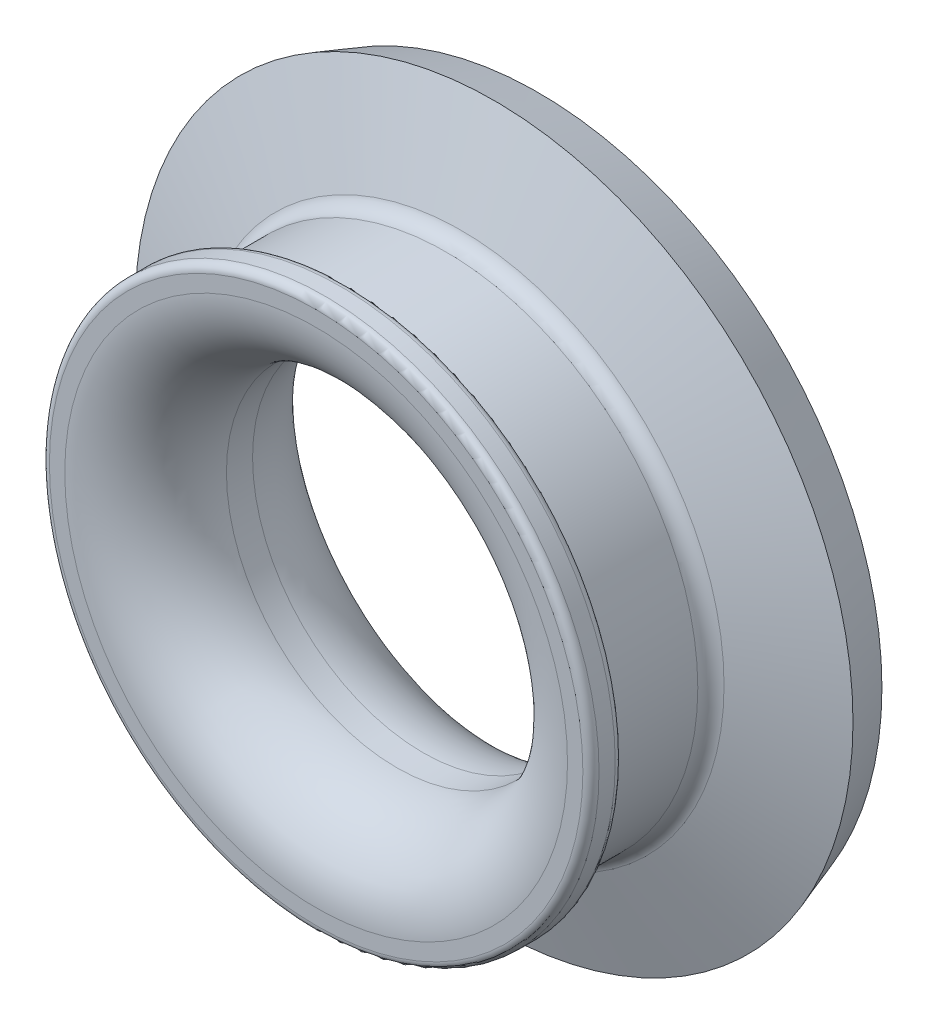
ISO-10303-21;
HEADER;
FILE_DESCRIPTION(('STEP AP214'),'2;1');
FILE_NAME('part.step','',(''),(''),'','','');
FILE_SCHEMA(('AUTOMOTIVE_DESIGN { 1 0 10303 214 1 1 1 1 }'));
ENDSEC;
DATA;
#1=APPLICATION_CONTEXT('core data for automotive mechanical design processes');
#2=APPLICATION_PROTOCOL_DEFINITION('international standard','automotive_design',2000,#1);
#3=PRODUCT_CONTEXT('',#1,'mechanical');
#4=PRODUCT('Part','Part','',(#3));
#5=PRODUCT_RELATED_PRODUCT_CATEGORY('part','',(#4));
#6=PRODUCT_DEFINITION_FORMATION('','',#4);
#7=PRODUCT_DEFINITION_CONTEXT('part definition',#1,'design');
#8=PRODUCT_DEFINITION('design','',#6,#7);
#9=PRODUCT_DEFINITION_SHAPE('','',#8);
#10=(LENGTH_UNIT() NAMED_UNIT(*) SI_UNIT(.MILLI.,.METRE.));
#11=(NAMED_UNIT(*) PLANE_ANGLE_UNIT() SI_UNIT($,.RADIAN.));
#12=(NAMED_UNIT(*) SI_UNIT($,.STERADIAN.) SOLID_ANGLE_UNIT());
#13=UNCERTAINTY_MEASURE_WITH_UNIT(LENGTH_MEASURE(1.E-05),#10,'distance_accuracy_value','');
#14=(GEOMETRIC_REPRESENTATION_CONTEXT(3) GLOBAL_UNCERTAINTY_ASSIGNED_CONTEXT((#13)) GLOBAL_UNIT_ASSIGNED_CONTEXT((#10,
#11,#12)) REPRESENTATION_CONTEXT('',''));
#15=CARTESIAN_POINT('',(0.,0.,0.));
#16=DIRECTION('',(0.,0.,1.));
#17=DIRECTION('',(1.,0.,0.));
#18=AXIS2_PLACEMENT_3D('',#15,#16,#17);
#19=CARTESIAN_POINT('',(0.,0.,-3.));
#20=DIRECTION('',(0.,0.,1.));
#21=DIRECTION('',(1.,0.,0.));
#22=AXIS2_PLACEMENT_3D('',#19,#20,#21);
#23=TOROIDAL_SURFACE('',#22,33.,1.);
#24=CARTESIAN_POINT('',(0.,0.,-3.));
#25=DIRECTION('',(0.,0.,1.));
#26=DIRECTION('',(1.,0.,0.));
#27=AXIS2_PLACEMENT_3D('',#24,#25,#26);
#28=CIRCLE('',#27,34.);
#29=CARTESIAN_POINT('',(34.,0.,-3.));
#30=VERTEX_POINT('',#29);
#31=EDGE_CURVE('E10',#30,#30,#28,.T.);
#32=ORIENTED_EDGE('',*,*,#31,.F.);
#33=EDGE_LOOP('',(#32));
#34=FACE_BOUND('',#33,.T.);
#35=CARTESIAN_POINT('',(0.,0.,-4.));
#36=DIRECTION('',(0.,0.,1.));
#37=DIRECTION('',(1.,0.,0.));
#38=AXIS2_PLACEMENT_3D('',#35,#36,#37);
#39=CIRCLE('',#38,33.);
#40=CARTESIAN_POINT('',(33.,0.,-4.));
#41=VERTEX_POINT('',#40);
#42=EDGE_CURVE('E81',#41,#41,#39,.T.);
#43=ORIENTED_EDGE('',*,*,#42,.T.);
#44=EDGE_LOOP('',(#43));
#45=FACE_BOUND('',#44,.T.);
#46=ADVANCED_FACE('F35',(#34,#45),#23,.T.);
#47=CARTESIAN_POINT('',(0.,0.,0.));
#48=DIRECTION('',(0.,0.,1.));
#49=DIRECTION('',(1.,0.,0.));
#50=AXIS2_PLACEMENT_3D('',#47,#48,#49);
#51=CYLINDRICAL_SURFACE('',#50,34.);
#52=CARTESIAN_POINT('',(0.,0.,-1.));
#53=DIRECTION('',(0.,0.,1.));
#54=DIRECTION('',(1.,0.,0.));
#55=AXIS2_PLACEMENT_3D('',#52,#53,#54);
#56=CIRCLE('',#55,34.);
#57=CARTESIAN_POINT('',(34.,0.,-1.));
#58=VERTEX_POINT('',#57);
#59=EDGE_CURVE('E41',#58,#58,#56,.T.);
#60=ORIENTED_EDGE('',*,*,#59,.F.);
#61=EDGE_LOOP('',(#60));
#62=FACE_BOUND('',#61,.T.);
#63=ORIENTED_EDGE('',*,*,#31,.T.);
#64=EDGE_LOOP('',(#63));
#65=FACE_BOUND('',#64,.T.);
#66=ADVANCED_FACE('F154',(#62,#65),#51,.T.);
#67=CARTESIAN_POINT('',(0.,0.,-1.));
#68=DIRECTION('',(0.,0.,1.));
#69=DIRECTION('',(1.,0.,0.));
#70=AXIS2_PLACEMENT_3D('',#67,#68,#69);
#71=TOROIDAL_SURFACE('',#70,33.,1.);
#72=CARTESIAN_POINT('',(0.,0.,0.));
#73=DIRECTION('',(0.,0.,1.));
#74=DIRECTION('',(1.,0.,0.));
#75=AXIS2_PLACEMENT_3D('',#72,#73,#74);
#76=CIRCLE('',#75,33.);
#77=CARTESIAN_POINT('',(33.,0.,0.));
#78=VERTEX_POINT('',#77);
#79=EDGE_CURVE('E45',#78,#78,#76,.T.);
#80=ORIENTED_EDGE('',*,*,#79,.F.);
#81=EDGE_LOOP('',(#80));
#82=FACE_BOUND('',#81,.T.);
#83=ORIENTED_EDGE('',*,*,#59,.T.);
#84=EDGE_LOOP('',(#83));
#85=FACE_BOUND('',#84,.T.);
#86=ADVANCED_FACE('F149',(#82,#85),#71,.T.);
#87=CARTESIAN_POINT('',(0.,33.,0.));
#88=DIRECTION('',(0.,0.,-1.));
#89=DIRECTION('',(-1.,0.,0.));
#90=AXIS2_PLACEMENT_3D('',#87,#88,#89);
#91=PLANE('',#90);
#92=CARTESIAN_POINT('',(0.,0.,0.));
#93=DIRECTION('',(0.,0.,1.));
#94=DIRECTION('',(1.,0.,0.));
#95=AXIS2_PLACEMENT_3D('',#92,#93,#94);
#96=CIRCLE('',#95,31.1);
#97=CARTESIAN_POINT('',(31.1,0.,0.));
#98=VERTEX_POINT('',#97);
#99=EDGE_CURVE('E49',#98,#98,#96,.T.);
#100=ORIENTED_EDGE('',*,*,#99,.F.);
#101=EDGE_LOOP('',(#100));
#102=FACE_BOUND('',#101,.T.);
#103=ORIENTED_EDGE('',*,*,#79,.T.);
#104=EDGE_LOOP('',(#103));
#105=FACE_BOUND('',#104,.T.);
#106=ADVANCED_FACE('F143',(#102,#105),#91,.F.);
#107=CARTESIAN_POINT('',(0.,0.,-10.));
#108=DIRECTION('',(0.,0.,1.));
#109=DIRECTION('',(1.,0.,0.));
#110=AXIS2_PLACEMENT_3D('',#107,#108,#109);
#111=TOROIDAL_SURFACE('',#110,31.1,10.);
#112=CARTESIAN_POINT('',(0.,0.,-10.));
#113=DIRECTION('',(0.,0.,1.));
#114=DIRECTION('',(1.,0.,0.));
#115=AXIS2_PLACEMENT_3D('',#112,#113,#114);
#116=CIRCLE('',#115,21.1);
#117=CARTESIAN_POINT('',(21.1,0.,-10.));
#118=VERTEX_POINT('',#117);
#119=EDGE_CURVE('E54',#118,#118,#116,.T.);
#120=ORIENTED_EDGE('',*,*,#119,.F.);
#121=EDGE_LOOP('',(#120));
#122=FACE_BOUND('',#121,.T.);
#123=ORIENTED_EDGE('',*,*,#99,.T.);
#124=EDGE_LOOP('',(#123));
#125=FACE_BOUND('',#124,.T.);
#126=ADVANCED_FACE('F137',(#122,#125),#111,.T.);
#127=CARTESIAN_POINT('',(0.,0.,0.));
#128=DIRECTION('',(0.,0.,1.));
#129=DIRECTION('',(1.,0.,0.));
#130=AXIS2_PLACEMENT_3D('',#127,#128,#129);
#131=CYLINDRICAL_SURFACE('',#130,21.1);
#132=CARTESIAN_POINT('',(0.,0.,-13.2338811819215));
#133=DIRECTION('',(0.,0.,1.));
#134=DIRECTION('',(1.,0.,0.));
#135=AXIS2_PLACEMENT_3D('',#132,#133,#134);
#136=CIRCLE('',#135,21.1);
#137=CARTESIAN_POINT('',(21.1,0.,-13.2338811819215));
#138=VERTEX_POINT('',#137);
#139=EDGE_CURVE('E57',#138,#138,#136,.T.);
#140=ORIENTED_EDGE('',*,*,#139,.F.);
#141=EDGE_LOOP('',(#140));
#142=FACE_BOUND('',#141,.T.);
#143=ORIENTED_EDGE('',*,*,#119,.T.);
#144=EDGE_LOOP('',(#143));
#145=FACE_BOUND('',#144,.T.);
#146=ADVANCED_FACE('F131',(#142,#145),#131,.F.);
#147=CARTESIAN_POINT('',(0.,0.,-13.2338811819215));
#148=DIRECTION('',(0.,0.,1.));
#149=DIRECTION('',(1.,0.,0.));
#150=AXIS2_PLACEMENT_3D('',#147,#148,#149);
#151=TOROIDAL_SURFACE('',#150,33.1,12.);
#152=CARTESIAN_POINT('',(0.,0.,-24.9716523907272));
#153=DIRECTION('',(0.,0.,1.));
#154=DIRECTION('',(1.,0.,0.));
#155=AXIS2_PLACEMENT_3D('',#152,#153,#154);
#156=CIRCLE('',#155,30.605059710187);
#157=CARTESIAN_POINT('',(30.605059710187,0.,-24.9716523907272));
#158=VERTEX_POINT('',#157);
#159=EDGE_CURVE('E60',#158,#158,#156,.T.);
#160=ORIENTED_EDGE('',*,*,#159,.F.);
#161=EDGE_LOOP('',(#160));
#162=FACE_BOUND('',#161,.T.);
#163=ORIENTED_EDGE('',*,*,#139,.T.);
#164=EDGE_LOOP('',(#163));
#165=FACE_BOUND('',#164,.T.);
#166=ADVANCED_FACE('F125',(#162,#165),#151,.T.);
#167=CARTESIAN_POINT('',(0.,0.,-24.9716523907272));
#168=DIRECTION('',(0.,0.,-1.));
#169=DIRECTION('',(-1.,0.,0.));
#170=AXIS2_PLACEMENT_3D('',#167,#168,#169);
#171=CONICAL_SURFACE('',#170,30.605059710187,1.36135681655558);
#172=CARTESIAN_POINT('',(0.,0.,-27.5));
#173=DIRECTION('',(0.,0.,1.));
#174=DIRECTION('',(1.,0.,0.));
#175=AXIS2_PLACEMENT_3D('',#172,#173,#174);
#176=CIRCLE('',#175,42.5);
#177=CARTESIAN_POINT('',(42.5,0.,-27.5));
#178=VERTEX_POINT('',#177);
#179=EDGE_CURVE('E63',#178,#178,#176,.T.);
#180=ORIENTED_EDGE('',*,*,#179,.F.);
#181=EDGE_LOOP('',(#180));
#182=FACE_BOUND('',#181,.T.);
#183=ORIENTED_EDGE('',*,*,#159,.T.);
#184=EDGE_LOOP('',(#183));
#185=FACE_BOUND('',#184,.T.);
#186=ADVANCED_FACE('F119',(#182,#185),#171,.F.);
#187=CARTESIAN_POINT('',(0.,0.,-27.5));
#188=DIRECTION('',(0.,0.,1.));
#189=DIRECTION('',(1.,0.,0.));
#190=AXIS2_PLACEMENT_3D('',#187,#188,#189);
#191=CONICAL_SURFACE('',#190,42.5,0.333747678346421);
#192=CARTESIAN_POINT('',(0.,0.,-22.0200364964719));
#193=DIRECTION('',(0.,0.,1.));
#194=DIRECTION('',(1.,0.,0.));
#195=AXIS2_PLACEMENT_3D('',#192,#193,#194);
#196=CIRCLE('',#195,44.4);
#197=CARTESIAN_POINT('',(44.4,0.,-22.0200364964719));
#198=VERTEX_POINT('',#197);
#199=EDGE_CURVE('E66',#198,#198,#196,.T.);
#200=ORIENTED_EDGE('',*,*,#199,.F.);
#201=EDGE_LOOP('',(#200));
#202=FACE_BOUND('',#201,.T.);
#203=ORIENTED_EDGE('',*,*,#179,.T.);
#204=EDGE_LOOP('',(#203));
#205=FACE_BOUND('',#204,.T.);
#206=ADVANCED_FACE('F113',(#202,#205),#191,.T.);
#207=CARTESIAN_POINT('',(0.,0.,-22.0200364964719));
#208=DIRECTION('',(0.,0.,-1.));
#209=DIRECTION('',(-1.,0.,0.));
#210=AXIS2_PLACEMENT_3D('',#207,#208,#209);
#211=CONICAL_SURFACE('',#210,44.4,1.24204093477408);
#212=CARTESIAN_POINT('',(0.,0.,-17.9619884437877));
#213=DIRECTION('',(0.,0.,1.));
#214=DIRECTION('',(1.,0.,0.));
#215=AXIS2_PLACEMENT_3D('',#212,#213,#214);
#216=CIRCLE('',#215,32.5042693482596);
#217=CARTESIAN_POINT('',(32.5042693482596,0.,-17.9619884437877));
#218=VERTEX_POINT('',#217);
#219=EDGE_CURVE('E69',#218,#218,#216,.T.);
#220=ORIENTED_EDGE('',*,*,#219,.F.);
#221=EDGE_LOOP('',(#220));
#222=FACE_BOUND('',#221,.T.);
#223=ORIENTED_EDGE('',*,*,#199,.T.);
#224=EDGE_LOOP('',(#223));
#225=FACE_BOUND('',#224,.T.);
#226=ADVANCED_FACE('F107',(#222,#225),#211,.T.);
#227=CARTESIAN_POINT('',(0.,0.,-16.0690986093274));
#228=DIRECTION('',(0.,0.,1.));
#229=DIRECTION('',(1.,0.,0.));
#230=AXIS2_PLACEMENT_3D('',#227,#228,#229);
#231=TOROIDAL_SURFACE('',#230,33.15,2.);
#232=CARTESIAN_POINT('',(0.,0.,-16.0690986093274));
#233=DIRECTION('',(0.,0.,1.));
#234=DIRECTION('',(1.,0.,0.));
#235=AXIS2_PLACEMENT_3D('',#232,#233,#234);
#236=CIRCLE('',#235,31.15);
#237=CARTESIAN_POINT('',(31.15,0.,-16.0690986093274));
#238=VERTEX_POINT('',#237);
#239=EDGE_CURVE('E72',#238,#238,#236,.T.);
#240=ORIENTED_EDGE('',*,*,#239,.F.);
#241=EDGE_LOOP('',(#240));
#242=FACE_BOUND('',#241,.T.);
#243=ORIENTED_EDGE('',*,*,#219,.T.);
#244=EDGE_LOOP('',(#243));
#245=FACE_BOUND('',#244,.T.);
#246=ADVANCED_FACE('F101',(#242,#245),#231,.F.);
#247=CARTESIAN_POINT('',(0.,0.,0.));
#248=DIRECTION('',(0.,0.,1.));
#249=DIRECTION('',(1.,0.,0.));
#250=AXIS2_PLACEMENT_3D('',#247,#248,#249);
#251=CYLINDRICAL_SURFACE('',#250,31.15);
#252=CARTESIAN_POINT('',(0.,0.,-5.));
#253=DIRECTION('',(0.,0.,1.));
#254=DIRECTION('',(1.,0.,0.));
#255=AXIS2_PLACEMENT_3D('',#252,#253,#254);
#256=CIRCLE('',#255,31.15);
#257=CARTESIAN_POINT('',(31.15,0.,-5.));
#258=VERTEX_POINT('',#257);
#259=EDGE_CURVE('E75',#258,#258,#256,.T.);
#260=ORIENTED_EDGE('',*,*,#259,.F.);
#261=EDGE_LOOP('',(#260));
#262=FACE_BOUND('',#261,.T.);
#263=ORIENTED_EDGE('',*,*,#239,.T.);
#264=EDGE_LOOP('',(#263));
#265=FACE_BOUND('',#264,.T.);
#266=ADVANCED_FACE('F95',(#262,#265),#251,.T.);
#267=CARTESIAN_POINT('',(0.,0.,-5.));
#268=DIRECTION('',(0.,0.,1.));
#269=DIRECTION('',(1.,0.,0.));
#270=AXIS2_PLACEMENT_3D('',#267,#268,#269);
#271=TOROIDAL_SURFACE('',#270,32.15,0.999999999999999);
#272=CARTESIAN_POINT('',(0.,0.,-4.));
#273=DIRECTION('',(0.,0.,1.));
#274=DIRECTION('',(1.,0.,0.));
#275=AXIS2_PLACEMENT_3D('',#272,#273,#274);
#276=CIRCLE('',#275,32.15);
#277=CARTESIAN_POINT('',(32.15,0.,-4.));
#278=VERTEX_POINT('',#277);
#279=EDGE_CURVE('E78',#278,#278,#276,.T.);
#280=ORIENTED_EDGE('',*,*,#279,.F.);
#281=EDGE_LOOP('',(#280));
#282=FACE_BOUND('',#281,.T.);
#283=ORIENTED_EDGE('',*,*,#259,.T.);
#284=EDGE_LOOP('',(#283));
#285=FACE_BOUND('',#284,.T.);
#286=ADVANCED_FACE('F89',(#282,#285),#271,.F.);
#287=CARTESIAN_POINT('',(0.,32.15,-4.));
#288=DIRECTION('',(0.,0.,1.));
#289=DIRECTION('',(1.,0.,0.));
#290=AXIS2_PLACEMENT_3D('',#287,#288,#289);
#291=PLANE('',#290);
#292=ORIENTED_EDGE('',*,*,#42,.F.);
#293=EDGE_LOOP('',(#292));
#294=FACE_BOUND('',#293,.T.);
#295=ORIENTED_EDGE('',*,*,#279,.T.);
#296=EDGE_LOOP('',(#295));
#297=FACE_BOUND('',#296,.T.);
#298=ADVANCED_FACE('F86',(#294,#297),#291,.F.);
#299=CLOSED_SHELL('',(#46,#66,#86,#106,#126,#146,#166,#186,#206,#226,#246,#266,#286,#298));
#300=MANIFOLD_SOLID_BREP('B2',#299);
#301=ADVANCED_BREP_SHAPE_REPRESENTATION('',(#18,#300),#14);
#302=SHAPE_DEFINITION_REPRESENTATION(#9,#301);
ENDSEC;
END-ISO-10303-21;
